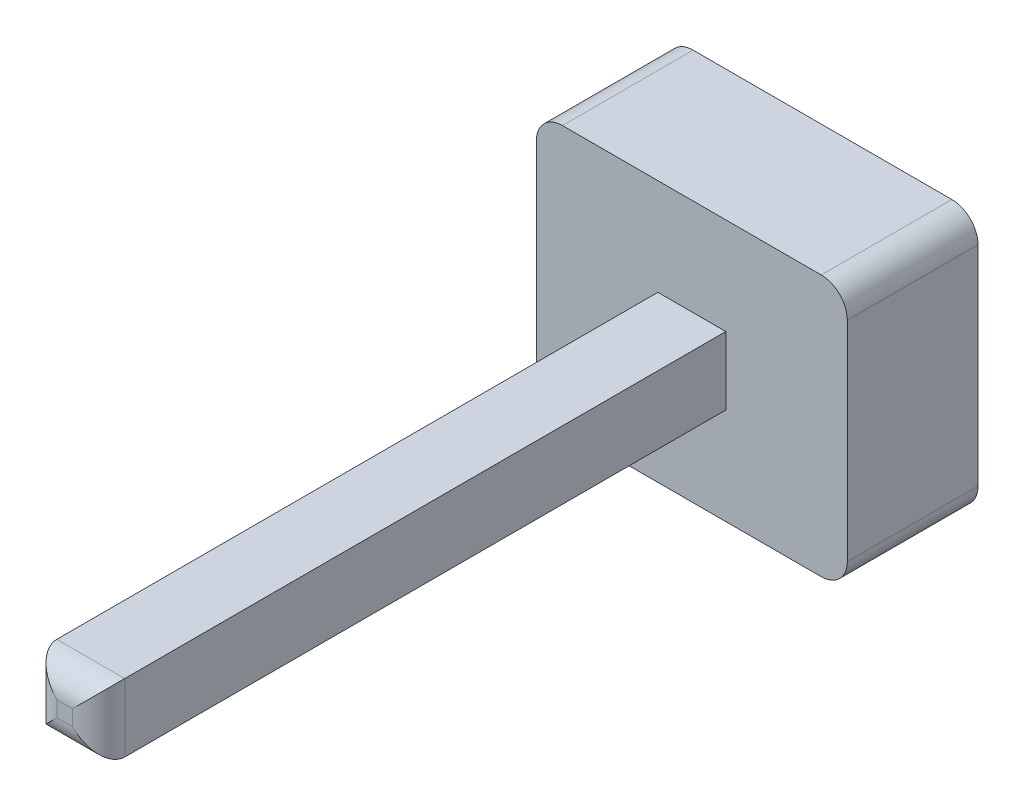
ISO-10303-21;
HEADER;
FILE_DESCRIPTION(('STEP AP214'),'2;1');
FILE_NAME('part.step','',(''),(''),'','','');
FILE_SCHEMA(('AUTOMOTIVE_DESIGN { 1 0 10303 214 1 1 1 1 }'));
ENDSEC;
DATA;
#1=APPLICATION_CONTEXT('core data for automotive mechanical design processes');
#2=APPLICATION_PROTOCOL_DEFINITION('international standard','automotive_design',2000,#1);
#3=PRODUCT_CONTEXT('',#1,'mechanical');
#4=PRODUCT('Part','Part','',(#3));
#5=PRODUCT_RELATED_PRODUCT_CATEGORY('part','',(#4));
#6=PRODUCT_DEFINITION_FORMATION('','',#4);
#7=PRODUCT_DEFINITION_CONTEXT('part definition',#1,'design');
#8=PRODUCT_DEFINITION('design','',#6,#7);
#9=PRODUCT_DEFINITION_SHAPE('','',#8);
#10=(LENGTH_UNIT() NAMED_UNIT(*) SI_UNIT(.MILLI.,.METRE.));
#11=(NAMED_UNIT(*) PLANE_ANGLE_UNIT() SI_UNIT($,.RADIAN.));
#12=(NAMED_UNIT(*) SI_UNIT($,.STERADIAN.) SOLID_ANGLE_UNIT());
#13=UNCERTAINTY_MEASURE_WITH_UNIT(LENGTH_MEASURE(1.E-05),#10,'distance_accuracy_value','');
#14=(GEOMETRIC_REPRESENTATION_CONTEXT(3) GLOBAL_UNCERTAINTY_ASSIGNED_CONTEXT((#13)) GLOBAL_UNIT_ASSIGNED_CONTEXT((#10,
#11,#12)) REPRESENTATION_CONTEXT('',''));
#15=CARTESIAN_POINT('',(0.,0.,0.));
#16=DIRECTION('',(0.,0.,1.));
#17=DIRECTION('',(1.,0.,0.));
#18=AXIS2_PLACEMENT_3D('',#15,#16,#17);
#19=CARTESIAN_POINT('',(-0.917245497890959,1.69205201040973,0.));
#20=DIRECTION('',(0.,0.,1.));
#21=DIRECTION('',(1.,0.,0.));
#22=AXIS2_PLACEMENT_3D('',#19,#20,#21);
#23=CYLINDRICAL_SURFACE('',#22,0.254);
#24=CARTESIAN_POINT('',(-0.917245497890959,1.69205201040973,1.27));
#25=DIRECTION('',(0.,0.,1.));
#26=DIRECTION('',(1.,0.,0.));
#27=AXIS2_PLACEMENT_3D('',#24,#25,#26);
#28=CIRCLE('',#27,0.254);
#29=CARTESIAN_POINT('',(-0.917245497890959,1.43805201040973,1.27));
#30=VERTEX_POINT('',#29);
#31=CARTESIAN_POINT('',(-0.663245497890959,1.69205201040973,1.27));
#32=VERTEX_POINT('',#31);
#33=EDGE_CURVE('E151',#30,#32,#28,.T.);
#34=ORIENTED_EDGE('',*,*,#33,.F.);
#35=DIRECTION('',(0.,0.,1.));
#36=VECTOR('',#35,1.);
#37=CARTESIAN_POINT('',(-0.917245497890959,1.43805201040973,0.));
#38=LINE('',#37,#36);
#39=CARTESIAN_POINT('',(-0.917245497890959,1.43805201040973,0.));
#40=VERTEX_POINT('',#39);
#41=EDGE_CURVE('E205',#40,#30,#38,.T.);
#42=ORIENTED_EDGE('',*,*,#41,.F.);
#43=CARTESIAN_POINT('',(-0.917245497890959,1.69205201040973,0.));
#44=DIRECTION('',(0.,0.,1.));
#45=DIRECTION('',(1.,0.,0.));
#46=AXIS2_PLACEMENT_3D('',#43,#44,#45);
#47=CIRCLE('',#46,0.254);
#48=CARTESIAN_POINT('',(-0.663245497890959,1.69205201040973,0.));
#49=VERTEX_POINT('',#48);
#50=EDGE_CURVE('E160',#40,#49,#47,.T.);
#51=ORIENTED_EDGE('',*,*,#50,.T.);
#52=DIRECTION('',(0.,0.,1.));
#53=VECTOR('',#52,1.);
#54=CARTESIAN_POINT('',(-0.663245497890959,1.69205201040973,0.));
#55=LINE('',#54,#53);
#56=EDGE_CURVE('E184',#49,#32,#55,.T.);
#57=ORIENTED_EDGE('',*,*,#56,.T.);
#58=EDGE_LOOP('',(#34,#42,#51,#57));
#59=FACE_BOUND('',#58,.T.);
#60=ADVANCED_FACE('F32',(#59),#23,.T.);
#61=CARTESIAN_POINT('',(-3.43184549789096,1.43805201040973,0.));
#62=DIRECTION('',(0.,-1.,0.));
#63=DIRECTION('',(0.,0.,-1.));
#64=AXIS2_PLACEMENT_3D('',#61,#62,#63);
#65=PLANE('',#64);
#66=DIRECTION('',(1.,0.,0.));
#67=VECTOR('',#66,1.);
#68=CARTESIAN_POINT('',(-3.43184549789096,1.43805201040973,1.27));
#69=LINE('',#68,#67);
#70=CARTESIAN_POINT('',(-3.43184549789096,1.43805201040973,1.27));
#71=VERTEX_POINT('',#70);
#72=EDGE_CURVE('E164',#71,#30,#69,.T.);
#73=ORIENTED_EDGE('',*,*,#72,.F.);
#74=DIRECTION('',(0.,0.,1.));
#75=VECTOR('',#74,1.);
#76=CARTESIAN_POINT('',(-3.43184549789096,1.43805201040973,0.));
#77=LINE('',#76,#75);
#78=CARTESIAN_POINT('',(-3.43184549789096,1.43805201040973,0.));
#79=VERTEX_POINT('',#78);
#80=EDGE_CURVE('E208',#79,#71,#77,.T.);
#81=ORIENTED_EDGE('',*,*,#80,.F.);
#82=DIRECTION('',(1.,0.,0.));
#83=VECTOR('',#82,1.);
#84=CARTESIAN_POINT('',(-3.43184549789096,1.43805201040973,0.));
#85=LINE('',#84,#83);
#86=EDGE_CURVE('E182',#79,#40,#85,.T.);
#87=ORIENTED_EDGE('',*,*,#86,.T.);
#88=ORIENTED_EDGE('',*,*,#41,.T.);
#89=EDGE_LOOP('',(#73,#81,#87,#88));
#90=FACE_BOUND('',#89,.T.);
#91=ADVANCED_FACE('F276',(#90),#65,.T.);
#92=CARTESIAN_POINT('',(-3.43184549789096,1.69205201040973,0.));
#93=DIRECTION('',(0.,0.,1.));
#94=DIRECTION('',(1.,0.,0.));
#95=AXIS2_PLACEMENT_3D('',#92,#93,#94);
#96=CYLINDRICAL_SURFACE('',#95,0.254);
#97=CARTESIAN_POINT('',(-3.43184549789096,1.69205201040973,1.27));
#98=DIRECTION('',(0.,0.,1.));
#99=DIRECTION('',(1.,0.,0.));
#100=AXIS2_PLACEMENT_3D('',#97,#98,#99);
#101=CIRCLE('',#100,0.254);
#102=CARTESIAN_POINT('',(-3.68584549789096,1.69205201040973,1.27));
#103=VERTEX_POINT('',#102);
#104=EDGE_CURVE('E200',#103,#71,#101,.T.);
#105=ORIENTED_EDGE('',*,*,#104,.F.);
#106=DIRECTION('',(0.,0.,1.));
#107=VECTOR('',#106,1.);
#108=CARTESIAN_POINT('',(-3.68584549789096,1.69205201040973,0.));
#109=LINE('',#108,#107);
#110=CARTESIAN_POINT('',(-3.68584549789096,1.69205201040973,0.));
#111=VERTEX_POINT('',#110);
#112=EDGE_CURVE('E210',#111,#103,#109,.T.);
#113=ORIENTED_EDGE('',*,*,#112,.F.);
#114=CARTESIAN_POINT('',(-3.43184549789096,1.69205201040973,0.));
#115=DIRECTION('',(0.,0.,1.));
#116=DIRECTION('',(1.,0.,0.));
#117=AXIS2_PLACEMENT_3D('',#114,#115,#116);
#118=CIRCLE('',#117,0.254);
#119=EDGE_CURVE('E179',#111,#79,#118,.T.);
#120=ORIENTED_EDGE('',*,*,#119,.T.);
#121=ORIENTED_EDGE('',*,*,#80,.T.);
#122=EDGE_LOOP('',(#105,#113,#120,#121));
#123=FACE_BOUND('',#122,.T.);
#124=ADVANCED_FACE('F282',(#123),#96,.T.);
#125=CARTESIAN_POINT('',(-3.68584549789096,3.72405201040976,0.));
#126=DIRECTION('',(-1.,0.,0.));
#127=DIRECTION('',(0.,0.,1.));
#128=AXIS2_PLACEMENT_3D('',#125,#126,#127);
#129=PLANE('',#128);
#130=DIRECTION('',(0.,-1.,0.));
#131=VECTOR('',#130,1.);
#132=CARTESIAN_POINT('',(-3.68584549789096,3.72405201040976,1.27));
#133=LINE('',#132,#131);
#134=CARTESIAN_POINT('',(-3.68584549789096,3.72405201040976,1.27));
#135=VERTEX_POINT('',#134);
#136=EDGE_CURVE('E197',#135,#103,#133,.T.);
#137=ORIENTED_EDGE('',*,*,#136,.F.);
#138=DIRECTION('',(0.,0.,1.));
#139=VECTOR('',#138,1.);
#140=CARTESIAN_POINT('',(-3.68584549789096,3.72405201040976,0.));
#141=LINE('',#140,#139);
#142=CARTESIAN_POINT('',(-3.68584549789096,3.72405201040976,0.));
#143=VERTEX_POINT('',#142);
#144=EDGE_CURVE('E212',#143,#135,#141,.T.);
#145=ORIENTED_EDGE('',*,*,#144,.F.);
#146=DIRECTION('',(0.,-1.,0.));
#147=VECTOR('',#146,1.);
#148=CARTESIAN_POINT('',(-3.68584549789096,3.72405201040976,0.));
#149=LINE('',#148,#147);
#150=EDGE_CURVE('E176',#143,#111,#149,.T.);
#151=ORIENTED_EDGE('',*,*,#150,.T.);
#152=ORIENTED_EDGE('',*,*,#112,.T.);
#153=EDGE_LOOP('',(#137,#145,#151,#152));
#154=FACE_BOUND('',#153,.T.);
#155=ADVANCED_FACE('F318',(#154),#129,.T.);
#156=CARTESIAN_POINT('',(-3.43184549789096,3.72405201040976,0.));
#157=DIRECTION('',(0.,0.,1.));
#158=DIRECTION('',(1.,0.,0.));
#159=AXIS2_PLACEMENT_3D('',#156,#157,#158);
#160=CYLINDRICAL_SURFACE('',#159,0.253999999999994);
#161=CARTESIAN_POINT('',(-3.43184549789096,3.72405201040976,1.27));
#162=DIRECTION('',(0.,0.,1.));
#163=DIRECTION('',(1.,0.,0.));
#164=AXIS2_PLACEMENT_3D('',#161,#162,#163);
#165=CIRCLE('',#164,0.253999999999994);
#166=CARTESIAN_POINT('',(-3.43184549789096,3.97805201040975,1.27));
#167=VERTEX_POINT('',#166);
#168=EDGE_CURVE('E194',#167,#135,#165,.T.);
#169=ORIENTED_EDGE('',*,*,#168,.F.);
#170=DIRECTION('',(0.,0.,1.));
#171=VECTOR('',#170,1.);
#172=CARTESIAN_POINT('',(-3.43184549789096,3.97805201040975,0.));
#173=LINE('',#172,#171);
#174=CARTESIAN_POINT('',(-3.43184549789096,3.97805201040975,0.));
#175=VERTEX_POINT('',#174);
#176=EDGE_CURVE('E214',#175,#167,#173,.T.);
#177=ORIENTED_EDGE('',*,*,#176,.F.);
#178=CARTESIAN_POINT('',(-3.43184549789096,3.72405201040976,0.));
#179=DIRECTION('',(0.,0.,1.));
#180=DIRECTION('',(1.,0.,0.));
#181=AXIS2_PLACEMENT_3D('',#178,#179,#180);
#182=CIRCLE('',#181,0.253999999999994);
#183=EDGE_CURVE('E173',#175,#143,#182,.T.);
#184=ORIENTED_EDGE('',*,*,#183,.T.);
#185=ORIENTED_EDGE('',*,*,#144,.T.);
#186=EDGE_LOOP('',(#169,#177,#184,#185));
#187=FACE_BOUND('',#186,.T.);
#188=ADVANCED_FACE('F322',(#187),#160,.T.);
#189=CARTESIAN_POINT('',(-0.917245497890959,3.97805201040975,0.));
#190=DIRECTION('',(0.,1.,0.));
#191=DIRECTION('',(0.,0.,1.));
#192=AXIS2_PLACEMENT_3D('',#189,#190,#191);
#193=PLANE('',#192);
#194=DIRECTION('',(-1.,0.,0.));
#195=VECTOR('',#194,1.);
#196=CARTESIAN_POINT('',(-0.917245497890959,3.97805201040975,1.27));
#197=LINE('',#196,#195);
#198=CARTESIAN_POINT('',(-0.917245497890959,3.97805201040975,1.27));
#199=VERTEX_POINT('',#198);
#200=EDGE_CURVE('E191',#199,#167,#197,.T.);
#201=ORIENTED_EDGE('',*,*,#200,.F.);
#202=DIRECTION('',(0.,0.,1.));
#203=VECTOR('',#202,1.);
#204=CARTESIAN_POINT('',(-0.917245497890959,3.97805201040975,0.));
#205=LINE('',#204,#203);
#206=CARTESIAN_POINT('',(-0.917245497890959,3.97805201040975,0.));
#207=VERTEX_POINT('',#206);
#208=EDGE_CURVE('E216',#207,#199,#205,.T.);
#209=ORIENTED_EDGE('',*,*,#208,.F.);
#210=DIRECTION('',(-1.,0.,0.));
#211=VECTOR('',#210,1.);
#212=CARTESIAN_POINT('',(-0.917245497890959,3.97805201040975,0.));
#213=LINE('',#212,#211);
#214=EDGE_CURVE('E170',#207,#175,#213,.T.);
#215=ORIENTED_EDGE('',*,*,#214,.T.);
#216=ORIENTED_EDGE('',*,*,#176,.T.);
#217=EDGE_LOOP('',(#201,#209,#215,#216));
#218=FACE_BOUND('',#217,.T.);
#219=ADVANCED_FACE('F326',(#218),#193,.T.);
#220=CARTESIAN_POINT('',(-0.917245497890959,3.72405201040976,0.));
#221=DIRECTION('',(0.,0.,1.));
#222=DIRECTION('',(1.,0.,0.));
#223=AXIS2_PLACEMENT_3D('',#220,#221,#222);
#224=CYLINDRICAL_SURFACE('',#223,0.253999999999994);
#225=CARTESIAN_POINT('',(-0.917245497890959,3.72405201040976,1.27));
#226=DIRECTION('',(0.,0.,1.));
#227=DIRECTION('',(1.,0.,0.));
#228=AXIS2_PLACEMENT_3D('',#225,#226,#227);
#229=CIRCLE('',#228,0.253999999999994);
#230=CARTESIAN_POINT('',(-0.663245497890965,3.72405201040976,1.27));
#231=VERTEX_POINT('',#230);
#232=EDGE_CURVE('E188',#231,#199,#229,.T.);
#233=ORIENTED_EDGE('',*,*,#232,.F.);
#234=DIRECTION('',(0.,0.,1.));
#235=VECTOR('',#234,1.);
#236=CARTESIAN_POINT('',(-0.663245497890965,3.72405201040976,0.));
#237=LINE('',#236,#235);
#238=CARTESIAN_POINT('',(-0.663245497890965,3.72405201040976,0.));
#239=VERTEX_POINT('',#238);
#240=EDGE_CURVE('E218',#239,#231,#237,.T.);
#241=ORIENTED_EDGE('',*,*,#240,.F.);
#242=CARTESIAN_POINT('',(-0.917245497890959,3.72405201040976,0.));
#243=DIRECTION('',(0.,0.,1.));
#244=DIRECTION('',(1.,0.,0.));
#245=AXIS2_PLACEMENT_3D('',#242,#243,#244);
#246=CIRCLE('',#245,0.253999999999994);
#247=EDGE_CURVE('E167',#239,#207,#246,.T.);
#248=ORIENTED_EDGE('',*,*,#247,.T.);
#249=ORIENTED_EDGE('',*,*,#208,.T.);
#250=EDGE_LOOP('',(#233,#241,#248,#249));
#251=FACE_BOUND('',#250,.T.);
#252=ADVANCED_FACE('F329',(#251),#224,.T.);
#253=CARTESIAN_POINT('',(-0.663245497890959,1.69205201040973,0.));
#254=DIRECTION('',(1.,0.,0.));
#255=DIRECTION('',(0.,1.,0.));
#256=AXIS2_PLACEMENT_3D('',#253,#254,#255);
#257=PLANE('',#256);
#258=DIRECTION('',(0.,1.,0.));
#259=VECTOR('',#258,1.);
#260=CARTESIAN_POINT('',(-0.663245497890959,1.69205201040973,1.27));
#261=LINE('',#260,#259);
#262=EDGE_CURVE('E155',#32,#231,#261,.T.);
#263=ORIENTED_EDGE('',*,*,#262,.F.);
#264=ORIENTED_EDGE('',*,*,#56,.F.);
#265=DIRECTION('',(0.,1.,0.));
#266=VECTOR('',#265,1.);
#267=CARTESIAN_POINT('',(-0.663245497890959,1.69205201040973,0.));
#268=LINE('',#267,#266);
#269=EDGE_CURVE('E163',#49,#239,#268,.T.);
#270=ORIENTED_EDGE('',*,*,#269,.T.);
#271=ORIENTED_EDGE('',*,*,#240,.T.);
#272=EDGE_LOOP('',(#263,#264,#270,#271));
#273=FACE_BOUND('',#272,.T.);
#274=ADVANCED_FACE('F288',(#273),#257,.T.);
#275=CARTESIAN_POINT('',(-0.917245497890959,1.69205201040973,0.));
#276=DIRECTION('',(0.,0.,1.));
#277=DIRECTION('',(1.,0.,0.));
#278=AXIS2_PLACEMENT_3D('',#275,#276,#277);
#279=PLANE('',#278);
#280=ORIENTED_EDGE('',*,*,#50,.F.);
#281=ORIENTED_EDGE('',*,*,#86,.F.);
#282=ORIENTED_EDGE('',*,*,#119,.F.);
#283=ORIENTED_EDGE('',*,*,#150,.F.);
#284=ORIENTED_EDGE('',*,*,#183,.F.);
#285=ORIENTED_EDGE('',*,*,#214,.F.);
#286=ORIENTED_EDGE('',*,*,#247,.F.);
#287=ORIENTED_EDGE('',*,*,#269,.F.);
#288=EDGE_LOOP('',(#280,#281,#282,#283,#284,#285,#286,#287));
#289=FACE_BOUND('',#288,.T.);
#290=ADVANCED_FACE('F310',(#289),#279,.F.);
#291=CARTESIAN_POINT('',(-0.917245497890959,1.69205201040973,1.27));
#292=DIRECTION('',(0.,0.,1.));
#293=DIRECTION('',(1.,0.,0.));
#294=AXIS2_PLACEMENT_3D('',#291,#292,#293);
#295=PLANE('',#294);
#296=DIRECTION('',(0.,-1.,0.));
#297=VECTOR('',#296,1.);
#298=CARTESIAN_POINT('',(-1.84434549789096,2.37785201040976,1.27));
#299=LINE('',#298,#297);
#300=CARTESIAN_POINT('',(-1.84434549789096,3.03825201040976,1.27));
#301=VERTEX_POINT('',#300);
#302=CARTESIAN_POINT('',(-1.84434549789096,2.37785201040976,1.27));
#303=VERTEX_POINT('',#302);
#304=EDGE_CURVE('E152',#301,#303,#299,.T.);
#305=ORIENTED_EDGE('',*,*,#304,.T.);
#306=DIRECTION('',(-1.,0.,0.));
#307=VECTOR('',#306,1.);
#308=CARTESIAN_POINT('',(-2.50474549789096,2.37785201040976,1.27));
#309=LINE('',#308,#307);
#310=CARTESIAN_POINT('',(-2.50474549789096,2.37785201040976,1.27));
#311=VERTEX_POINT('',#310);
#312=EDGE_CURVE('E141',#303,#311,#309,.T.);
#313=ORIENTED_EDGE('',*,*,#312,.T.);
#314=DIRECTION('',(0.,1.,0.));
#315=VECTOR('',#314,1.);
#316=CARTESIAN_POINT('',(-2.50474549789096,3.03825201040976,1.27));
#317=LINE('',#316,#315);
#318=CARTESIAN_POINT('',(-2.50474549789096,3.03825201040976,1.27));
#319=VERTEX_POINT('',#318);
#320=EDGE_CURVE('E134',#311,#319,#317,.T.);
#321=ORIENTED_EDGE('',*,*,#320,.T.);
#322=DIRECTION('',(1.,0.,0.));
#323=VECTOR('',#322,1.);
#324=CARTESIAN_POINT('',(-1.84434549789096,3.03825201040976,1.27));
#325=LINE('',#324,#323);
#326=EDGE_CURVE('E138',#319,#301,#325,.T.);
#327=ORIENTED_EDGE('',*,*,#326,.T.);
#328=EDGE_LOOP('',(#305,#313,#321,#327));
#329=FACE_BOUND('',#328,.T.);
#330=ORIENTED_EDGE('',*,*,#33,.T.);
#331=ORIENTED_EDGE('',*,*,#262,.T.);
#332=ORIENTED_EDGE('',*,*,#232,.T.);
#333=ORIENTED_EDGE('',*,*,#200,.T.);
#334=ORIENTED_EDGE('',*,*,#168,.T.);
#335=ORIENTED_EDGE('',*,*,#136,.T.);
#336=ORIENTED_EDGE('',*,*,#104,.T.);
#337=ORIENTED_EDGE('',*,*,#72,.T.);
#338=EDGE_LOOP('',(#330,#331,#332,#333,#334,#335,#336,#337));
#339=FACE_BOUND('',#338,.T.);
#340=ADVANCED_FACE('F135',(#329,#339),#295,.T.);
#341=CARTESIAN_POINT('',(-1.84434549789096,2.37785201040976,0.336053363408808));
#342=DIRECTION('',(1.,0.,0.));
#343=DIRECTION('',(0.,0.,-1.));
#344=AXIS2_PLACEMENT_3D('',#341,#342,#343);
#345=PLANE('',#344);
#346=DIRECTION('',(0.,0.,1.));
#347=VECTOR('',#346,1.);
#348=CARTESIAN_POINT('',(-1.84434549789096,3.03825201040976,0.336053363408808));
#349=LINE('',#348,#347);
#350=CARTESIAN_POINT('',(-1.84434549789096,3.03825201040976,7.112));
#351=VERTEX_POINT('',#350);
#352=EDGE_CURVE('E148',#301,#351,#349,.T.);
#353=ORIENTED_EDGE('',*,*,#352,.T.);
#354=DIRECTION('',(0.,1.,0.));
#355=VECTOR('',#354,1.);
#356=CARTESIAN_POINT('',(-1.84434549789096,2.37785201040976,7.112));
#357=LINE('',#356,#355);
#358=CARTESIAN_POINT('',(-1.84434549789096,2.37785201040976,7.112));
#359=VERTEX_POINT('',#358);
#360=EDGE_CURVE('E232',#351,#359,#357,.F.);
#361=ORIENTED_EDGE('',*,*,#360,.T.);
#362=DIRECTION('',(0.,0.,1.));
#363=VECTOR('',#362,1.);
#364=CARTESIAN_POINT('',(-1.84434549789096,2.37785201040976,0.336053363408808));
#365=LINE('',#364,#363);
#366=EDGE_CURVE('E143',#303,#359,#365,.T.);
#367=ORIENTED_EDGE('',*,*,#366,.F.);
#368=ORIENTED_EDGE('',*,*,#304,.F.);
#369=EDGE_LOOP('',(#353,#361,#367,#368));
#370=FACE_BOUND('',#369,.T.);
#371=ADVANCED_FACE('F249',(#370),#345,.T.);
#372=CARTESIAN_POINT('',(-2.50474549789096,2.37785201040976,0.336053363408808));
#373=DIRECTION('',(0.,-1.,0.));
#374=DIRECTION('',(0.,0.,-1.));
#375=AXIS2_PLACEMENT_3D('',#372,#373,#374);
#376=PLANE('',#375);
#377=ORIENTED_EDGE('',*,*,#366,.T.);
#378=DIRECTION('',(1.,0.,0.));
#379=VECTOR('',#378,1.);
#380=CARTESIAN_POINT('',(-2.50474549789096,2.37785201040976,7.112));
#381=LINE('',#380,#379);
#382=CARTESIAN_POINT('',(-2.50474549789096,2.37785201040976,7.112));
#383=VERTEX_POINT('',#382);
#384=EDGE_CURVE('E229',#359,#383,#381,.F.);
#385=ORIENTED_EDGE('',*,*,#384,.T.);
#386=DIRECTION('',(0.,0.,1.));
#387=VECTOR('',#386,1.);
#388=CARTESIAN_POINT('',(-2.50474549789096,2.37785201040976,0.336053363408808));
#389=LINE('',#388,#387);
#390=EDGE_CURVE('E147',#311,#383,#389,.T.);
#391=ORIENTED_EDGE('',*,*,#390,.F.);
#392=ORIENTED_EDGE('',*,*,#312,.F.);
#393=EDGE_LOOP('',(#377,#385,#391,#392));
#394=FACE_BOUND('',#393,.T.);
#395=ADVANCED_FACE('F262',(#394),#376,.T.);
#396=CARTESIAN_POINT('',(-2.50474549789096,3.03825201040976,0.336053363408808));
#397=DIRECTION('',(-1.,0.,0.));
#398=DIRECTION('',(0.,0.,1.));
#399=AXIS2_PLACEMENT_3D('',#396,#397,#398);
#400=PLANE('',#399);
#401=ORIENTED_EDGE('',*,*,#390,.T.);
#402=DIRECTION('',(0.,-1.,0.));
#403=VECTOR('',#402,1.);
#404=CARTESIAN_POINT('',(-2.50474549789096,3.03825201040976,7.112));
#405=LINE('',#404,#403);
#406=CARTESIAN_POINT('',(-2.50474549789096,3.03825201040976,7.112));
#407=VERTEX_POINT('',#406);
#408=EDGE_CURVE('E41',#383,#407,#405,.F.);
#409=ORIENTED_EDGE('',*,*,#408,.T.);
#410=DIRECTION('',(0.,0.,1.));
#411=VECTOR('',#410,1.);
#412=CARTESIAN_POINT('',(-2.50474549789096,3.03825201040976,0.336053363408808));
#413=LINE('',#412,#411);
#414=EDGE_CURVE('E145',#319,#407,#413,.T.);
#415=ORIENTED_EDGE('',*,*,#414,.F.);
#416=ORIENTED_EDGE('',*,*,#320,.F.);
#417=EDGE_LOOP('',(#401,#409,#415,#416));
#418=FACE_BOUND('',#417,.T.);
#419=ADVANCED_FACE('F146',(#418),#400,.T.);
#420=CARTESIAN_POINT('',(-1.84434549789096,3.03825201040976,0.336053363408808));
#421=DIRECTION('',(0.,1.,0.));
#422=DIRECTION('',(0.,0.,1.));
#423=AXIS2_PLACEMENT_3D('',#420,#421,#422);
#424=PLANE('',#423);
#425=ORIENTED_EDGE('',*,*,#414,.T.);
#426=DIRECTION('',(-1.,0.,0.));
#427=VECTOR('',#426,1.);
#428=CARTESIAN_POINT('',(-1.84434549789096,3.03825201040976,7.112));
#429=LINE('',#428,#427);
#430=EDGE_CURVE('E11',#407,#351,#429,.F.);
#431=ORIENTED_EDGE('',*,*,#430,.T.);
#432=ORIENTED_EDGE('',*,*,#352,.F.);
#433=ORIENTED_EDGE('',*,*,#326,.F.);
#434=EDGE_LOOP('',(#425,#431,#432,#433));
#435=FACE_BOUND('',#434,.T.);
#436=ADVANCED_FACE('F150',(#435),#424,.T.);
#437=CARTESIAN_POINT('',(-1.84434549789096,3.03825201040976,7.366));
#438=DIRECTION('',(0.,0.,1.));
#439=DIRECTION('',(1.,0.,0.));
#440=AXIS2_PLACEMENT_3D('',#437,#438,#439);
#441=PLANE('',#440);
#442=DIRECTION('',(0.,-1.,0.));
#443=VECTOR('',#442,1.);
#444=CARTESIAN_POINT('',(-2.25074549789096,3.03825201040976,7.366));
#445=LINE('',#444,#443);
#446=CARTESIAN_POINT('',(-2.25074549789096,2.78425201040976,7.366));
#447=VERTEX_POINT('',#446);
#448=CARTESIAN_POINT('',(-2.25074549789096,2.63185201040976,7.366));
#449=VERTEX_POINT('',#448);
#450=EDGE_CURVE('E222',#447,#449,#445,.T.);
#451=ORIENTED_EDGE('',*,*,#450,.T.);
#452=DIRECTION('',(1.,0.,0.));
#453=VECTOR('',#452,1.);
#454=CARTESIAN_POINT('',(-1.84434549789096,2.63185201040976,7.366));
#455=LINE('',#454,#453);
#456=CARTESIAN_POINT('',(-2.09834549789096,2.63185201040976,7.366));
#457=VERTEX_POINT('',#456);
#458=EDGE_CURVE('E226',#449,#457,#455,.T.);
#459=ORIENTED_EDGE('',*,*,#458,.T.);
#460=DIRECTION('',(0.,1.,0.));
#461=VECTOR('',#460,1.);
#462=CARTESIAN_POINT('',(-2.09834549789096,3.03825201040976,7.366));
#463=LINE('',#462,#461);
#464=CARTESIAN_POINT('',(-2.09834549789096,2.78425201040976,7.366));
#465=VERTEX_POINT('',#464);
#466=EDGE_CURVE('E224',#457,#465,#463,.T.);
#467=ORIENTED_EDGE('',*,*,#466,.T.);
#468=DIRECTION('',(-1.,0.,0.));
#469=VECTOR('',#468,1.);
#470=CARTESIAN_POINT('',(-1.84434549789096,2.78425201040976,7.366));
#471=LINE('',#470,#469);
#472=EDGE_CURVE('E207',#465,#447,#471,.T.);
#473=ORIENTED_EDGE('',*,*,#472,.T.);
#474=EDGE_LOOP('',(#451,#459,#467,#473));
#475=FACE_BOUND('',#474,.T.);
#476=ADVANCED_FACE('F298',(#475),#441,.T.);
#477=CARTESIAN_POINT('',(-1.84434549789096,2.78425201040976,7.112));
#478=DIRECTION('',(-1.,0.,0.));
#479=DIRECTION('',(0.,0.,1.));
#480=AXIS2_PLACEMENT_3D('',#477,#478,#479);
#481=CYLINDRICAL_SURFACE('',#480,0.254);
#482=CARTESIAN_POINT('',(-2.09834549789096,2.78425201040976,7.112));
#483=DIRECTION('',(-0.707106781186547,0.707106781186547,0.));
#484=DIRECTION('',(-0.707106781186547,-0.707106781186547,0.));
#485=AXIS2_PLACEMENT_3D('',#482,#483,#484);
#486=ELLIPSE('',#485,0.359210244842766,0.254);
#487=EDGE_CURVE('E238',#351,#465,#486,.F.);
#488=ORIENTED_EDGE('',*,*,#487,.F.);
#489=ORIENTED_EDGE('',*,*,#430,.F.);
#490=CARTESIAN_POINT('',(-2.25074549789096,2.78425201040976,7.112));
#491=DIRECTION('',(-0.707106781186547,-0.707106781186547,0.));
#492=DIRECTION('',(-0.707106781186547,0.707106781186547,0.));
#493=AXIS2_PLACEMENT_3D('',#490,#491,#492);
#494=ELLIPSE('',#493,0.359210244842766,0.254);
#495=EDGE_CURVE('E36',#447,#407,#494,.T.);
#496=ORIENTED_EDGE('',*,*,#495,.F.);
#497=ORIENTED_EDGE('',*,*,#472,.F.);
#498=EDGE_LOOP('',(#488,#489,#496,#497));
#499=FACE_BOUND('',#498,.T.);
#500=ADVANCED_FACE('F34',(#499),#481,.T.);
#501=CARTESIAN_POINT('',(-2.25074549789096,3.03825201040976,7.112));
#502=DIRECTION('',(0.,-1.,0.));
#503=DIRECTION('',(0.,0.,-1.));
#504=AXIS2_PLACEMENT_3D('',#501,#502,#503);
#505=CYLINDRICAL_SURFACE('',#504,0.254);
#506=ORIENTED_EDGE('',*,*,#495,.T.);
#507=ORIENTED_EDGE('',*,*,#408,.F.);
#508=CARTESIAN_POINT('',(-2.25074549789096,2.63185201040976,7.112));
#509=DIRECTION('',(0.707106781186547,-0.707106781186547,0.));
#510=DIRECTION('',(-0.707106781186547,-0.707106781186547,0.));
#511=AXIS2_PLACEMENT_3D('',#508,#509,#510);
#512=ELLIPSE('',#511,0.359210244842766,0.254);
#513=EDGE_CURVE('E237',#449,#383,#512,.T.);
#514=ORIENTED_EDGE('',*,*,#513,.F.);
#515=ORIENTED_EDGE('',*,*,#450,.F.);
#516=EDGE_LOOP('',(#506,#507,#514,#515));
#517=FACE_BOUND('',#516,.T.);
#518=ADVANCED_FACE('F293',(#517),#505,.T.);
#519=CARTESIAN_POINT('',(-2.09834549789096,3.03825201040976,7.112));
#520=DIRECTION('',(0.,1.,0.));
#521=DIRECTION('',(0.,0.,1.));
#522=AXIS2_PLACEMENT_3D('',#519,#520,#521);
#523=CYLINDRICAL_SURFACE('',#522,0.254);
#524=ORIENTED_EDGE('',*,*,#487,.T.);
#525=ORIENTED_EDGE('',*,*,#466,.F.);
#526=CARTESIAN_POINT('',(-2.09834549789096,2.63185201040976,7.112));
#527=DIRECTION('',(0.707106781186547,0.707106781186547,0.));
#528=DIRECTION('',(-0.707106781186547,0.707106781186547,0.));
#529=AXIS2_PLACEMENT_3D('',#526,#527,#528);
#530=ELLIPSE('',#529,0.359210244842766,0.254);
#531=EDGE_CURVE('E235',#359,#457,#530,.F.);
#532=ORIENTED_EDGE('',*,*,#531,.F.);
#533=ORIENTED_EDGE('',*,*,#360,.F.);
#534=EDGE_LOOP('',(#524,#525,#532,#533));
#535=FACE_BOUND('',#534,.T.);
#536=ADVANCED_FACE('F255',(#535),#523,.T.);
#537=CARTESIAN_POINT('',(-1.84434549789096,2.63185201040976,7.112));
#538=DIRECTION('',(1.,0.,0.));
#539=DIRECTION('',(0.,0.,-1.));
#540=AXIS2_PLACEMENT_3D('',#537,#538,#539);
#541=CYLINDRICAL_SURFACE('',#540,0.254);
#542=ORIENTED_EDGE('',*,*,#513,.T.);
#543=ORIENTED_EDGE('',*,*,#384,.F.);
#544=ORIENTED_EDGE('',*,*,#531,.T.);
#545=ORIENTED_EDGE('',*,*,#458,.F.);
#546=EDGE_LOOP('',(#542,#543,#544,#545));
#547=FACE_BOUND('',#546,.T.);
#548=ADVANCED_FACE('F259',(#547),#541,.T.);
#549=CLOSED_SHELL('',(#60,#91,#124,#155,#188,#219,#252,#274,#290,#340,#371,#395,#419,#436,#476,
#500,#518,#536,#548));
#550=MANIFOLD_SOLID_BREP('B2',#549);
#551=ADVANCED_BREP_SHAPE_REPRESENTATION('',(#18,#550),#14);
#552=SHAPE_DEFINITION_REPRESENTATION(#9,#551);
ENDSEC;
END-ISO-10303-21;
